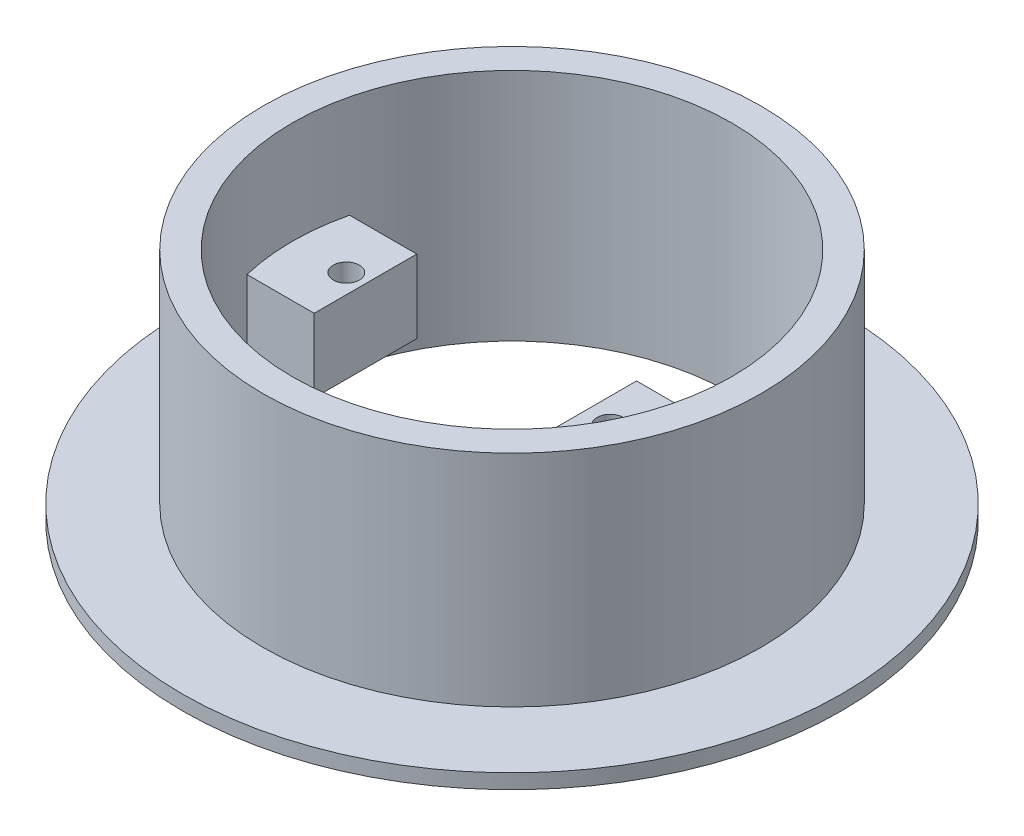
ISO-10303-21;
HEADER;
FILE_DESCRIPTION(('STEP AP214'),'2;1');
FILE_NAME('part.step','',(''),(''),'','','');
FILE_SCHEMA(('AUTOMOTIVE_DESIGN { 1 0 10303 214 1 1 1 1 }'));
ENDSEC;
DATA;
#1=APPLICATION_CONTEXT('core data for automotive mechanical design processes');
#2=APPLICATION_PROTOCOL_DEFINITION('international standard','automotive_design',2000,#1);
#3=PRODUCT_CONTEXT('',#1,'mechanical');
#4=PRODUCT('Part','Part','',(#3));
#5=PRODUCT_RELATED_PRODUCT_CATEGORY('part','',(#4));
#6=PRODUCT_DEFINITION_FORMATION('','',#4);
#7=PRODUCT_DEFINITION_CONTEXT('part definition',#1,'design');
#8=PRODUCT_DEFINITION('design','',#6,#7);
#9=PRODUCT_DEFINITION_SHAPE('','',#8);
#10=(LENGTH_UNIT() NAMED_UNIT(*) SI_UNIT(.MILLI.,.METRE.));
#11=(NAMED_UNIT(*) PLANE_ANGLE_UNIT() SI_UNIT($,.RADIAN.));
#12=(NAMED_UNIT(*) SI_UNIT($,.STERADIAN.) SOLID_ANGLE_UNIT());
#13=UNCERTAINTY_MEASURE_WITH_UNIT(LENGTH_MEASURE(1.E-05),#10,'distance_accuracy_value','');
#14=(GEOMETRIC_REPRESENTATION_CONTEXT(3) GLOBAL_UNCERTAINTY_ASSIGNED_CONTEXT((#13)) GLOBAL_UNIT_ASSIGNED_CONTEXT((#10,
#11,#12)) REPRESENTATION_CONTEXT('',''));
#15=CARTESIAN_POINT('',(0.,0.,0.));
#16=DIRECTION('',(0.,0.,1.));
#17=DIRECTION('',(1.,0.,0.));
#18=AXIS2_PLACEMENT_3D('',#15,#16,#17);
#19=CARTESIAN_POINT('',(10.,18.,7.));
#20=DIRECTION('',(1.,0.,0.));
#21=DIRECTION('',(0.,1.,0.));
#22=AXIS2_PLACEMENT_3D('',#19,#20,#21);
#23=PLANE('',#22);
#24=DIRECTION('',(0.,-1.,0.));
#25=VECTOR('',#24,1.);
#26=CARTESIAN_POINT('',(10.,18.,-7.));
#27=LINE('',#26,#25);
#28=CARTESIAN_POINT('',(10.,18.,-7.));
#29=VERTEX_POINT('',#28);
#30=CARTESIAN_POINT('',(10.,2.,-7.));
#31=VERTEX_POINT('',#30);
#32=EDGE_CURVE('E57',#29,#31,#27,.T.);
#33=ORIENTED_EDGE('',*,*,#32,.T.);
#34=DIRECTION('',(0.,0.,1.));
#35=VECTOR('',#34,1.);
#36=CARTESIAN_POINT('',(10.,2.,7.));
#37=LINE('',#36,#35);
#38=CARTESIAN_POINT('',(10.,2.,7.));
#39=VERTEX_POINT('',#38);
#40=EDGE_CURVE('E64',#31,#39,#37,.T.);
#41=ORIENTED_EDGE('',*,*,#40,.T.);
#42=DIRECTION('',(0.,-1.,0.));
#43=VECTOR('',#42,1.);
#44=CARTESIAN_POINT('',(10.,18.,7.));
#45=LINE('',#44,#43);
#46=CARTESIAN_POINT('',(10.,18.,7.));
#47=VERTEX_POINT('',#46);
#48=EDGE_CURVE('E100',#47,#39,#45,.T.);
#49=ORIENTED_EDGE('',*,*,#48,.F.);
#50=DIRECTION('',(0.,0.,-1.));
#51=VECTOR('',#50,1.);
#52=CARTESIAN_POINT('',(10.,18.,7.));
#53=LINE('',#52,#51);
#54=EDGE_CURVE('E92',#47,#29,#53,.T.);
#55=ORIENTED_EDGE('',*,*,#54,.T.);
#56=EDGE_LOOP('',(#33,#41,#49,#55));
#57=FACE_BOUND('',#56,.T.);
#58=ADVANCED_FACE('F49',(#57),#23,.F.);
#59=CARTESIAN_POINT('',(17.,18.,7.));
#60=DIRECTION('',(1.,0.,0.));
#61=DIRECTION('',(0.,1.,0.));
#62=AXIS2_PLACEMENT_3D('',#59,#60,#61);
#63=PLANE('',#62);
#64=DIRECTION('',(0.,0.,1.));
#65=VECTOR('',#64,1.);
#66=CARTESIAN_POINT('',(17.,2.,7.));
#67=LINE('',#66,#65);
#68=CARTESIAN_POINT('',(17.,2.,-7.));
#69=VERTEX_POINT('',#68);
#70=CARTESIAN_POINT('',(17.,2.,7.));
#71=VERTEX_POINT('',#70);
#72=EDGE_CURVE('E115',#69,#71,#67,.T.);
#73=ORIENTED_EDGE('',*,*,#72,.F.);
#74=DIRECTION('',(0.,-1.,0.));
#75=VECTOR('',#74,1.);
#76=CARTESIAN_POINT('',(17.,18.,-7.));
#77=LINE('',#76,#75);
#78=CARTESIAN_POINT('',(17.,18.,-7.));
#79=VERTEX_POINT('',#78);
#80=EDGE_CURVE('E90',#79,#69,#77,.T.);
#81=ORIENTED_EDGE('',*,*,#80,.F.);
#82=DIRECTION('',(0.,0.,-1.));
#83=VECTOR('',#82,1.);
#84=CARTESIAN_POINT('',(17.,18.,7.));
#85=LINE('',#84,#83);
#86=CARTESIAN_POINT('',(17.,18.,7.));
#87=VERTEX_POINT('',#86);
#88=EDGE_CURVE('E72',#87,#79,#85,.T.);
#89=ORIENTED_EDGE('',*,*,#88,.F.);
#90=DIRECTION('',(0.,-1.,0.));
#91=VECTOR('',#90,1.);
#92=CARTESIAN_POINT('',(17.,18.,7.));
#93=LINE('',#92,#91);
#94=EDGE_CURVE('E88',#87,#71,#93,.T.);
#95=ORIENTED_EDGE('',*,*,#94,.T.);
#96=EDGE_LOOP('',(#73,#81,#89,#95));
#97=FACE_BOUND('',#96,.T.);
#98=ADVANCED_FACE('F86',(#97),#63,.T.);
#99=CARTESIAN_POINT('',(10.,18.,7.));
#100=DIRECTION('',(0.,1.,0.));
#101=DIRECTION('',(0.,0.,1.));
#102=AXIS2_PLACEMENT_3D('',#99,#100,#101);
#103=PLANE('',#102);
#104=CARTESIAN_POINT('',(13.3884337890028,18.,0.));
#105=DIRECTION('',(0.,1.,0.));
#106=DIRECTION('',(0.,0.,1.));
#107=AXIS2_PLACEMENT_3D('',#104,#105,#106);
#108=CIRCLE('',#107,1.775);
#109=CARTESIAN_POINT('',(13.3884337890028,18.,1.775));
#110=VERTEX_POINT('',#109);
#111=EDGE_CURVE('E155',#110,#110,#108,.T.);
#112=ORIENTED_EDGE('',*,*,#111,.F.);
#113=EDGE_LOOP('',(#112));
#114=FACE_BOUND('',#113,.T.);
#115=DIRECTION('',(1.,0.,0.));
#116=VECTOR('',#115,1.);
#117=CARTESIAN_POINT('',(10.,18.,-7.));
#118=LINE('',#117,#116);
#119=EDGE_CURVE('E108',#29,#79,#118,.T.);
#120=ORIENTED_EDGE('',*,*,#119,.F.);
#121=ORIENTED_EDGE('',*,*,#54,.F.);
#122=DIRECTION('',(1.,0.,0.));
#123=VECTOR('',#122,1.);
#124=CARTESIAN_POINT('',(10.,18.,7.));
#125=LINE('',#124,#123);
#126=EDGE_CURVE('E99',#47,#87,#125,.T.);
#127=ORIENTED_EDGE('',*,*,#126,.T.);
#128=ORIENTED_EDGE('',*,*,#88,.T.);
#129=EDGE_LOOP('',(#120,#121,#127,#128));
#130=FACE_BOUND('',#129,.T.);
#131=ADVANCED_FACE('F102',(#114,#130),#103,.T.);
#132=CARTESIAN_POINT('',(0.,0.,7.));
#133=DIRECTION('',(0.,0.,1.));
#134=DIRECTION('',(1.,0.,0.));
#135=AXIS2_PLACEMENT_3D('',#132,#133,#134);
#136=PLANE('',#135);
#137=DIRECTION('',(-1.,0.,0.));
#138=VECTOR('',#137,1.);
#139=CARTESIAN_POINT('',(0.,2.,7.));
#140=LINE('',#139,#138);
#141=EDGE_CURVE('E93',#71,#39,#140,.T.);
#142=ORIENTED_EDGE('',*,*,#141,.F.);
#143=ORIENTED_EDGE('',*,*,#94,.F.);
#144=ORIENTED_EDGE('',*,*,#126,.F.);
#145=ORIENTED_EDGE('',*,*,#48,.T.);
#146=EDGE_LOOP('',(#142,#143,#144,#145));
#147=FACE_BOUND('',#146,.T.);
#148=ADVANCED_FACE('F51',(#147),#136,.T.);
#149=CARTESIAN_POINT('',(0.,0.,-7.));
#150=DIRECTION('',(0.,0.,1.));
#151=DIRECTION('',(1.,0.,0.));
#152=AXIS2_PLACEMENT_3D('',#149,#150,#151);
#153=PLANE('',#152);
#154=ORIENTED_EDGE('',*,*,#80,.T.);
#155=DIRECTION('',(-1.,0.,0.));
#156=VECTOR('',#155,1.);
#157=CARTESIAN_POINT('',(0.,2.,-7.));
#158=LINE('',#157,#156);
#159=EDGE_CURVE('E12',#69,#31,#158,.T.);
#160=ORIENTED_EDGE('',*,*,#159,.T.);
#161=ORIENTED_EDGE('',*,*,#32,.F.);
#162=ORIENTED_EDGE('',*,*,#119,.T.);
#163=EDGE_LOOP('',(#154,#160,#161,#162));
#164=FACE_BOUND('',#163,.T.);
#165=ADVANCED_FACE('F176',(#164),#153,.F.);
#166=CARTESIAN_POINT('',(0.,2.,0.));
#167=DIRECTION('',(0.,1.,0.));
#168=DIRECTION('',(0.,0.,1.));
#169=AXIS2_PLACEMENT_3D('',#166,#167,#168);
#170=PLANE('',#169);
#171=ORIENTED_EDGE('',*,*,#72,.T.);
#172=ORIENTED_EDGE('',*,*,#141,.T.);
#173=ORIENTED_EDGE('',*,*,#40,.F.);
#174=ORIENTED_EDGE('',*,*,#159,.F.);
#175=EDGE_LOOP('',(#171,#172,#173,#174));
#176=FACE_BOUND('',#175,.T.);
#177=DIRECTION('',(0.,0.,-1.));
#178=VECTOR('',#177,1.);
#179=CARTESIAN_POINT('',(9.01604117702178,2.,10.6853298303884));
#180=LINE('',#179,#178);
#181=CARTESIAN_POINT('',(9.01604117702178,2.,10.6853298303884));
#182=VERTEX_POINT('',#181);
#183=CARTESIAN_POINT('',(9.01604117702178,2.,-11.4713161582011));
#184=VERTEX_POINT('',#183);
#185=EDGE_CURVE('E121',#182,#184,#180,.T.);
#186=ORIENTED_EDGE('',*,*,#185,.F.);
#187=DIRECTION('',(0.985167795898411,0.,0.17159374675281));
#188=VECTOR('',#187,1.);
#189=CARTESIAN_POINT('',(9.01604117702178,2.,10.6853298303884));
#190=LINE('',#189,#188);
#191=CARTESIAN_POINT('',(26.6591042443495,2.,13.7583487704341));
#192=VERTEX_POINT('',#191);
#193=EDGE_CURVE('E136',#182,#192,#190,.T.);
#194=ORIENTED_EDGE('',*,*,#193,.T.);
#195=CARTESIAN_POINT('',(-0.546139414020683,2.,0.0104602003278405));
#196=DIRECTION('',(0.,1.,0.));
#197=DIRECTION('',(0.,0.,1.));
#198=AXIS2_PLACEMENT_3D('',#195,#196,#197);
#199=CIRCLE('',#198,30.4816292649745);
#200=CARTESIAN_POINT('',(26.1127186831509,2.,-14.7690867346164));
#201=VERTEX_POINT('',#200);
#202=EDGE_CURVE('E125',#201,#192,#199,.F.);
#203=ORIENTED_EDGE('',*,*,#202,.F.);
#204=DIRECTION('',(0.981900338780085,0.,-0.189398322863628));
#205=VECTOR('',#204,1.);
#206=CARTESIAN_POINT('',(9.01604117702178,2.,-11.4713161582011));
#207=LINE('',#206,#205);
#208=EDGE_CURVE('E126',#184,#201,#207,.T.);
#209=ORIENTED_EDGE('',*,*,#208,.F.);
#210=EDGE_LOOP('',(#186,#194,#203,#209));
#211=FACE_BOUND('',#210,.T.);
#212=ADVANCED_FACE('F186',(#176,#211),#170,.T.);
#213=CARTESIAN_POINT('',(9.01604117702178,37.375668323243,-11.4713161582011));
#214=DIRECTION('',(-0.189398322863628,0.,-0.981900338780085));
#215=DIRECTION('',(-0.981900338780085,0.,0.189398322863628));
#216=AXIS2_PLACEMENT_3D('',#213,#214,#215);
#217=PLANE('',#216);
#218=DIRECTION('',(0.,-1.,0.));
#219=VECTOR('',#218,1.);
#220=CARTESIAN_POINT('',(9.01604117702178,37.375668323243,-11.4713161582011));
#221=LINE('',#220,#219);
#222=CARTESIAN_POINT('',(9.01604117702178,0.,-11.4713161582011));
#223=VERTEX_POINT('',#222);
#224=EDGE_CURVE('E118',#184,#223,#221,.T.);
#225=ORIENTED_EDGE('',*,*,#224,.F.);
#226=ORIENTED_EDGE('',*,*,#208,.T.);
#227=DIRECTION('',(0.,-1.,0.));
#228=VECTOR('',#227,1.);
#229=CARTESIAN_POINT('',(26.1127186831509,37.375668323243,-14.7690867346164));
#230=LINE('',#229,#228);
#231=CARTESIAN_POINT('',(26.1127186831509,0.,-14.7690867346164));
#232=VERTEX_POINT('',#231);
#233=EDGE_CURVE('E122',#201,#232,#230,.T.);
#234=ORIENTED_EDGE('',*,*,#233,.T.);
#235=DIRECTION('',(0.981900338780085,0.,-0.189398322863628));
#236=VECTOR('',#235,1.);
#237=CARTESIAN_POINT('',(9.01604117702178,0.,-11.4713161582011));
#238=LINE('',#237,#236);
#239=EDGE_CURVE('E148',#223,#232,#238,.T.);
#240=ORIENTED_EDGE('',*,*,#239,.F.);
#241=EDGE_LOOP('',(#225,#226,#234,#240));
#242=FACE_BOUND('',#241,.T.);
#243=ADVANCED_FACE('F230',(#242),#217,.T.);
#244=CARTESIAN_POINT('',(-0.546139414020683,37.375668323243,0.0104602003278405));
#245=DIRECTION('',(0.,-1.,0.));
#246=DIRECTION('',(0.,0.,-1.));
#247=AXIS2_PLACEMENT_3D('',#244,#245,#246);
#248=CYLINDRICAL_SURFACE('',#247,30.4816292649745);
#249=ORIENTED_EDGE('',*,*,#233,.F.);
#250=ORIENTED_EDGE('',*,*,#202,.T.);
#251=DIRECTION('',(0.,-1.,0.));
#252=VECTOR('',#251,1.);
#253=CARTESIAN_POINT('',(26.6591042443495,37.375668323243,13.7583487704341));
#254=LINE('',#253,#252);
#255=CARTESIAN_POINT('',(26.6591042443495,0.,13.7583487704341));
#256=VERTEX_POINT('',#255);
#257=EDGE_CURVE('E127',#192,#256,#254,.T.);
#258=ORIENTED_EDGE('',*,*,#257,.T.);
#259=CARTESIAN_POINT('',(-0.546139414020683,0.,0.0104602003278405));
#260=DIRECTION('',(0.,-1.,0.));
#261=DIRECTION('',(0.,0.,-1.));
#262=AXIS2_PLACEMENT_3D('',#259,#260,#261);
#263=CIRCLE('',#262,30.4816292649745);
#264=EDGE_CURVE('E145',#232,#256,#263,.T.);
#265=ORIENTED_EDGE('',*,*,#264,.F.);
#266=EDGE_LOOP('',(#249,#250,#258,#265));
#267=FACE_BOUND('',#266,.T.);
#268=ADVANCED_FACE('F234',(#267),#248,.T.);
#269=CARTESIAN_POINT('',(9.01604117702178,37.375668323243,10.6853298303884));
#270=DIRECTION('',(0.17159374675281,0.,-0.985167795898411));
#271=DIRECTION('',(-0.985167795898411,0.,-0.17159374675281));
#272=AXIS2_PLACEMENT_3D('',#269,#270,#271);
#273=PLANE('',#272);
#274=ORIENTED_EDGE('',*,*,#193,.F.);
#275=DIRECTION('',(0.,-1.,0.));
#276=VECTOR('',#275,1.);
#277=CARTESIAN_POINT('',(9.01604117702178,37.375668323243,10.6853298303884));
#278=LINE('',#277,#276);
#279=CARTESIAN_POINT('',(9.01604117702178,0.,10.6853298303884));
#280=VERTEX_POINT('',#279);
#281=EDGE_CURVE('E130',#182,#280,#278,.T.);
#282=ORIENTED_EDGE('',*,*,#281,.T.);
#283=DIRECTION('',(0.98516779589841,0.,0.17159374675281));
#284=VECTOR('',#283,1.);
#285=CARTESIAN_POINT('',(9.01604117702178,0.,10.6853298303884));
#286=LINE('',#285,#284);
#287=EDGE_CURVE('E133',#280,#256,#286,.T.);
#288=ORIENTED_EDGE('',*,*,#287,.T.);
#289=ORIENTED_EDGE('',*,*,#257,.F.);
#290=EDGE_LOOP('',(#274,#282,#288,#289));
#291=FACE_BOUND('',#290,.T.);
#292=ADVANCED_FACE('F194',(#291),#273,.F.);
#293=CARTESIAN_POINT('',(9.01604117702178,37.375668323243,10.6853298303884));
#294=DIRECTION('',(-1.,0.,0.));
#295=DIRECTION('',(0.,0.,1.));
#296=AXIS2_PLACEMENT_3D('',#293,#294,#295);
#297=PLANE('',#296);
#298=ORIENTED_EDGE('',*,*,#281,.F.);
#299=ORIENTED_EDGE('',*,*,#185,.T.);
#300=ORIENTED_EDGE('',*,*,#224,.T.);
#301=DIRECTION('',(0.,0.,-1.));
#302=VECTOR('',#301,1.);
#303=CARTESIAN_POINT('',(9.01604117702178,0.,10.6853298303884));
#304=LINE('',#303,#302);
#305=EDGE_CURVE('E139',#280,#223,#304,.T.);
#306=ORIENTED_EDGE('',*,*,#305,.F.);
#307=EDGE_LOOP('',(#298,#299,#300,#306));
#308=FACE_BOUND('',#307,.T.);
#309=ADVANCED_FACE('F189',(#308),#297,.T.);
#310=CARTESIAN_POINT('',(10.,0.,7.));
#311=DIRECTION('',(0.,1.,0.));
#312=DIRECTION('',(0.,0.,1.));
#313=AXIS2_PLACEMENT_3D('',#310,#311,#312);
#314=PLANE('',#313);
#315=ORIENTED_EDGE('',*,*,#305,.T.);
#316=ORIENTED_EDGE('',*,*,#239,.T.);
#317=ORIENTED_EDGE('',*,*,#264,.T.);
#318=ORIENTED_EDGE('',*,*,#287,.F.);
#319=EDGE_LOOP('',(#315,#316,#317,#318));
#320=FACE_BOUND('',#319,.T.);
#321=ADVANCED_FACE('F166',(#320),#314,.F.);
#322=CARTESIAN_POINT('',(13.3884337890028,10.,0.));
#323=DIRECTION('',(0.,1.,0.));
#324=DIRECTION('',(0.,0.,1.));
#325=AXIS2_PLACEMENT_3D('',#322,#323,#324);
#326=CYLINDRICAL_SURFACE('',#325,1.775);
#327=CARTESIAN_POINT('',(13.3884337890028,10.,0.));
#328=DIRECTION('',(0.,1.,0.));
#329=DIRECTION('',(0.,0.,1.));
#330=AXIS2_PLACEMENT_3D('',#327,#328,#329);
#331=CIRCLE('',#330,1.775);
#332=CARTESIAN_POINT('',(13.3884337890028,10.,1.775));
#333=VERTEX_POINT('',#332);
#334=EDGE_CURVE('E140',#333,#333,#331,.T.);
#335=ORIENTED_EDGE('',*,*,#334,.F.);
#336=EDGE_LOOP('',(#335));
#337=FACE_BOUND('',#336,.T.);
#338=ORIENTED_EDGE('',*,*,#111,.T.);
#339=EDGE_LOOP('',(#338));
#340=FACE_BOUND('',#339,.T.);
#341=ADVANCED_FACE('F163',(#337,#340),#326,.F.);
#342=CARTESIAN_POINT('',(13.3884337890028,10.,0.));
#343=DIRECTION('',(0.,1.,0.));
#344=DIRECTION('',(0.,0.,1.));
#345=AXIS2_PLACEMENT_3D('',#342,#343,#344);
#346=PLANE('',#345);
#347=ORIENTED_EDGE('',*,*,#334,.T.);
#348=EDGE_LOOP('',(#347));
#349=FACE_BOUND('',#348,.T.);
#350=ADVANCED_FACE('F161',(#349),#346,.T.);
#351=CLOSED_SHELL('',(#58,#98,#131,#148,#165,#212,#243,#268,#292,#309,#321,#341,#350));
#352=MANIFOLD_SOLID_BREP('B2',#351);
#353=CARTESIAN_POINT('',(0.,2.,0.));
#354=DIRECTION('',(0.,1.,0.));
#355=DIRECTION('',(0.,0.,1.));
#356=AXIS2_PLACEMENT_3D('',#353,#354,#355);
#357=PLANE('',#356);
#358=CARTESIAN_POINT('',(0.,2.,0.));
#359=DIRECTION('',(0.,1.,0.));
#360=DIRECTION('',(0.,0.,1.));
#361=AXIS2_PLACEMENT_3D('',#358,#359,#360);
#362=CIRCLE('',#361,45.);
#363=CARTESIAN_POINT('',(0.,2.,45.));
#364=VERTEX_POINT('',#363);
#365=EDGE_CURVE('E405',#364,#364,#362,.T.);
#366=ORIENTED_EDGE('',*,*,#365,.T.);
#367=EDGE_LOOP('',(#366));
#368=FACE_BOUND('',#367,.T.);
#369=CARTESIAN_POINT('',(0.,2.,0.));
#370=DIRECTION('',(0.,1.,0.));
#371=DIRECTION('',(0.,0.,1.));
#372=AXIS2_PLACEMENT_3D('',#369,#370,#371);
#373=CIRCLE('',#372,34.);
#374=CARTESIAN_POINT('',(0.,2.,34.));
#375=VERTEX_POINT('',#374);
#376=EDGE_CURVE('E395',#375,#375,#373,.T.);
#377=ORIENTED_EDGE('',*,*,#376,.F.);
#378=EDGE_LOOP('',(#377));
#379=FACE_BOUND('',#378,.T.);
#380=ADVANCED_FACE('F321',(#368,#379),#357,.T.);
#381=CARTESIAN_POINT('',(0.,0.,0.));
#382=DIRECTION('',(0.,1.,0.));
#383=DIRECTION('',(0.,0.,1.));
#384=AXIS2_PLACEMENT_3D('',#381,#382,#383);
#385=PLANE('',#384);
#386=CARTESIAN_POINT('',(0.,0.,0.));
#387=DIRECTION('',(0.,1.,0.));
#388=DIRECTION('',(0.,0.,1.));
#389=AXIS2_PLACEMENT_3D('',#386,#387,#388);
#390=CIRCLE('',#389,45.);
#391=CARTESIAN_POINT('',(0.,0.,45.));
#392=VERTEX_POINT('',#391);
#393=EDGE_CURVE('E404',#392,#392,#390,.T.);
#394=ORIENTED_EDGE('',*,*,#393,.F.);
#395=EDGE_LOOP('',(#394));
#396=FACE_BOUND('',#395,.T.);
#397=CARTESIAN_POINT('',(0.,0.,0.));
#398=DIRECTION('',(0.,1.,0.));
#399=DIRECTION('',(0.,0.,1.));
#400=AXIS2_PLACEMENT_3D('',#397,#398,#399);
#401=CIRCLE('',#400,30.);
#402=CARTESIAN_POINT('',(0.,0.,30.));
#403=VERTEX_POINT('',#402);
#404=EDGE_CURVE('E399',#403,#403,#401,.T.);
#405=ORIENTED_EDGE('',*,*,#404,.T.);
#406=EDGE_LOOP('',(#405));
#407=FACE_BOUND('',#406,.T.);
#408=ADVANCED_FACE('F432',(#396,#407),#385,.F.);
#409=CARTESIAN_POINT('',(0.,2.,0.));
#410=DIRECTION('',(0.,-1.,0.));
#411=DIRECTION('',(0.,0.,-1.));
#412=AXIS2_PLACEMENT_3D('',#409,#410,#411);
#413=CYLINDRICAL_SURFACE('',#412,45.);
#414=ORIENTED_EDGE('',*,*,#365,.F.);
#415=EDGE_LOOP('',(#414));
#416=FACE_BOUND('',#415,.T.);
#417=ORIENTED_EDGE('',*,*,#393,.T.);
#418=EDGE_LOOP('',(#417));
#419=FACE_BOUND('',#418,.T.);
#420=ADVANCED_FACE('F323',(#416,#419),#413,.T.);
#421=CARTESIAN_POINT('',(0.,2.,0.));
#422=DIRECTION('',(0.,-1.,0.));
#423=DIRECTION('',(0.,0.,-1.));
#424=AXIS2_PLACEMENT_3D('',#421,#422,#423);
#425=CYLINDRICAL_SURFACE('',#424,30.);
#426=ORIENTED_EDGE('',*,*,#404,.F.);
#427=EDGE_LOOP('',(#426));
#428=FACE_BOUND('',#427,.T.);
#429=DIRECTION('',(0.,-1.,0.));
#430=VECTOR('',#429,1.);
#431=CARTESIAN_POINT('',(-29.1719042916296,2.,7.));
#432=LINE('',#431,#430);
#433=CARTESIAN_POINT('',(-29.1719042916296,18.,7.));
#434=VERTEX_POINT('',#433);
#435=CARTESIAN_POINT('',(-29.1719042916296,8.,7.));
#436=VERTEX_POINT('',#435);
#437=EDGE_CURVE('E47',#434,#436,#432,.T.);
#438=ORIENTED_EDGE('',*,*,#437,.F.);
#439=CARTESIAN_POINT('',(0.,18.,0.));
#440=DIRECTION('',(0.,-1.,0.));
#441=DIRECTION('',(0.,0.,-1.));
#442=AXIS2_PLACEMENT_3D('',#439,#440,#441);
#443=CIRCLE('',#442,30.);
#444=CARTESIAN_POINT('',(-29.1719042916296,18.,-7.));
#445=VERTEX_POINT('',#444);
#446=EDGE_CURVE('E344',#434,#445,#443,.T.);
#447=ORIENTED_EDGE('',*,*,#446,.T.);
#448=DIRECTION('',(0.,-1.,0.));
#449=VECTOR('',#448,1.);
#450=CARTESIAN_POINT('',(-29.1719042916296,2.,-7.));
#451=LINE('',#450,#449);
#452=CARTESIAN_POINT('',(-29.1719042916296,8.,-7.));
#453=VERTEX_POINT('',#452);
#454=EDGE_CURVE('E408',#445,#453,#451,.T.);
#455=ORIENTED_EDGE('',*,*,#454,.T.);
#456=CARTESIAN_POINT('',(0.,8.,0.));
#457=DIRECTION('',(0.,-1.,0.));
#458=DIRECTION('',(1.,0.,0.));
#459=AXIS2_PLACEMENT_3D('',#456,#457,#458);
#460=CIRCLE('',#459,30.);
#461=EDGE_CURVE('E329',#436,#453,#460,.T.);
#462=ORIENTED_EDGE('',*,*,#461,.F.);
#463=EDGE_LOOP('',(#438,#447,#455,#462));
#464=FACE_BOUND('',#463,.T.);
#465=CARTESIAN_POINT('',(0.,32.,0.));
#466=DIRECTION('',(0.,1.,0.));
#467=DIRECTION('',(0.,0.,1.));
#468=AXIS2_PLACEMENT_3D('',#465,#466,#467);
#469=CIRCLE('',#468,30.);
#470=CARTESIAN_POINT('',(0.,32.,30.));
#471=VERTEX_POINT('',#470);
#472=EDGE_CURVE('E371',#471,#471,#469,.T.);
#473=ORIENTED_EDGE('',*,*,#472,.T.);
#474=EDGE_LOOP('',(#473));
#475=FACE_BOUND('',#474,.T.);
#476=ADVANCED_FACE('F414',(#428,#464,#475),#425,.F.);
#477=CARTESIAN_POINT('',(0.,32.,0.));
#478=DIRECTION('',(0.,1.,0.));
#479=DIRECTION('',(0.,0.,1.));
#480=AXIS2_PLACEMENT_3D('',#477,#478,#479);
#481=PLANE('',#480);
#482=CARTESIAN_POINT('',(0.,32.,0.));
#483=DIRECTION('',(0.,1.,0.));
#484=DIRECTION('',(0.,0.,1.));
#485=AXIS2_PLACEMENT_3D('',#482,#483,#484);
#486=CIRCLE('',#485,34.);
#487=CARTESIAN_POINT('',(0.,32.,34.));
#488=VERTEX_POINT('',#487);
#489=EDGE_CURVE('E396',#488,#488,#486,.T.);
#490=ORIENTED_EDGE('',*,*,#489,.T.);
#491=EDGE_LOOP('',(#490));
#492=FACE_BOUND('',#491,.T.);
#493=ORIENTED_EDGE('',*,*,#472,.F.);
#494=EDGE_LOOP('',(#493));
#495=FACE_BOUND('',#494,.T.);
#496=ADVANCED_FACE('F443',(#492,#495),#481,.T.);
#497=CARTESIAN_POINT('',(0.,32.,0.));
#498=DIRECTION('',(0.,-1.,0.));
#499=DIRECTION('',(0.,0.,-1.));
#500=AXIS2_PLACEMENT_3D('',#497,#498,#499);
#501=CYLINDRICAL_SURFACE('',#500,34.);
#502=ORIENTED_EDGE('',*,*,#489,.F.);
#503=EDGE_LOOP('',(#502));
#504=FACE_BOUND('',#503,.T.);
#505=ORIENTED_EDGE('',*,*,#376,.T.);
#506=EDGE_LOOP('',(#505));
#507=FACE_BOUND('',#506,.T.);
#508=ADVANCED_FACE('F427',(#504,#507),#501,.T.);
#509=CARTESIAN_POINT('',(0.,8.,7.));
#510=DIRECTION('',(0.,-1.,0.));
#511=DIRECTION('',(1.,0.,0.));
#512=AXIS2_PLACEMENT_3D('',#509,#510,#511);
#513=PLANE('',#512);
#514=DIRECTION('',(-1.,0.,0.));
#515=VECTOR('',#514,1.);
#516=CARTESIAN_POINT('',(0.,8.,7.));
#517=LINE('',#516,#515);
#518=CARTESIAN_POINT('',(-20.,8.,7.));
#519=VERTEX_POINT('',#518);
#520=EDGE_CURVE('E367',#519,#436,#517,.T.);
#521=ORIENTED_EDGE('',*,*,#520,.T.);
#522=ORIENTED_EDGE('',*,*,#461,.T.);
#523=DIRECTION('',(-1.,0.,0.));
#524=VECTOR('',#523,1.);
#525=CARTESIAN_POINT('',(0.,8.,-7.));
#526=LINE('',#525,#524);
#527=CARTESIAN_POINT('',(-20.,8.,-7.));
#528=VERTEX_POINT('',#527);
#529=EDGE_CURVE('E336',#528,#453,#526,.T.);
#530=ORIENTED_EDGE('',*,*,#529,.F.);
#531=DIRECTION('',(0.,0.,-1.));
#532=VECTOR('',#531,1.);
#533=CARTESIAN_POINT('',(-20.,8.,7.));
#534=LINE('',#533,#532);
#535=EDGE_CURVE('E364',#519,#528,#534,.T.);
#536=ORIENTED_EDGE('',*,*,#535,.F.);
#537=EDGE_LOOP('',(#521,#522,#530,#536));
#538=FACE_BOUND('',#537,.T.);
#539=ADVANCED_FACE('F366',(#538),#513,.T.);
#540=CARTESIAN_POINT('',(0.,18.,7.));
#541=DIRECTION('',(0.,-1.,0.));
#542=DIRECTION('',(0.,0.,-1.));
#543=AXIS2_PLACEMENT_3D('',#540,#541,#542);
#544=PLANE('',#543);
#545=CARTESIAN_POINT('',(-22.6115662109972,18.,0.));
#546=DIRECTION('',(0.,1.,0.));
#547=DIRECTION('',(0.,0.,1.));
#548=AXIS2_PLACEMENT_3D('',#545,#546,#547);
#549=CIRCLE('',#548,1.775);
#550=CARTESIAN_POINT('',(-22.6115662109972,18.,1.775));
#551=VERTEX_POINT('',#550);
#552=EDGE_CURVE('E534',#551,#551,#549,.T.);
#553=ORIENTED_EDGE('',*,*,#552,.F.);
#554=EDGE_LOOP('',(#553));
#555=FACE_BOUND('',#554,.T.);
#556=ORIENTED_EDGE('',*,*,#446,.F.);
#557=DIRECTION('',(-1.,0.,0.));
#558=VECTOR('',#557,1.);
#559=CARTESIAN_POINT('',(0.,18.,7.));
#560=LINE('',#559,#558);
#561=CARTESIAN_POINT('',(-20.,18.,7.));
#562=VERTEX_POINT('',#561);
#563=EDGE_CURVE('E382',#562,#434,#560,.T.);
#564=ORIENTED_EDGE('',*,*,#563,.F.);
#565=DIRECTION('',(0.,0.,-1.));
#566=VECTOR('',#565,1.);
#567=CARTESIAN_POINT('',(-20.,18.,7.));
#568=LINE('',#567,#566);
#569=CARTESIAN_POINT('',(-20.,18.,-7.));
#570=VERTEX_POINT('',#569);
#571=EDGE_CURVE('E372',#562,#570,#568,.T.);
#572=ORIENTED_EDGE('',*,*,#571,.T.);
#573=DIRECTION('',(-1.,0.,0.));
#574=VECTOR('',#573,1.);
#575=CARTESIAN_POINT('',(0.,18.,-7.));
#576=LINE('',#575,#574);
#577=EDGE_CURVE('E379',#570,#445,#576,.T.);
#578=ORIENTED_EDGE('',*,*,#577,.T.);
#579=EDGE_LOOP('',(#556,#564,#572,#578));
#580=FACE_BOUND('',#579,.T.);
#581=ADVANCED_FACE('F418',(#555,#580),#544,.F.);
#582=CARTESIAN_POINT('',(-20.,0.,7.));
#583=DIRECTION('',(1.,0.,0.));
#584=DIRECTION('',(0.,1.,0.));
#585=AXIS2_PLACEMENT_3D('',#582,#583,#584);
#586=PLANE('',#585);
#587=DIRECTION('',(0.,-1.,0.));
#588=VECTOR('',#587,1.);
#589=CARTESIAN_POINT('',(-20.,0.,-7.));
#590=LINE('',#589,#588);
#591=EDGE_CURVE('E388',#570,#528,#590,.T.);
#592=ORIENTED_EDGE('',*,*,#591,.F.);
#593=ORIENTED_EDGE('',*,*,#571,.F.);
#594=DIRECTION('',(0.,-1.,0.));
#595=VECTOR('',#594,1.);
#596=CARTESIAN_POINT('',(-20.,0.,7.));
#597=LINE('',#596,#595);
#598=EDGE_CURVE('E377',#562,#519,#597,.T.);
#599=ORIENTED_EDGE('',*,*,#598,.T.);
#600=ORIENTED_EDGE('',*,*,#535,.T.);
#601=EDGE_LOOP('',(#592,#593,#599,#600));
#602=FACE_BOUND('',#601,.T.);
#603=ADVANCED_FACE('F381',(#602),#586,.T.);
#604=CARTESIAN_POINT('',(0.,0.,7.));
#605=DIRECTION('',(0.,0.,1.));
#606=DIRECTION('',(1.,0.,0.));
#607=AXIS2_PLACEMENT_3D('',#604,#605,#606);
#608=PLANE('',#607);
#609=ORIENTED_EDGE('',*,*,#563,.T.);
#610=ORIENTED_EDGE('',*,*,#437,.T.);
#611=ORIENTED_EDGE('',*,*,#520,.F.);
#612=ORIENTED_EDGE('',*,*,#598,.F.);
#613=EDGE_LOOP('',(#609,#610,#611,#612));
#614=FACE_BOUND('',#613,.T.);
#615=ADVANCED_FACE('F376',(#614),#608,.T.);
#616=CARTESIAN_POINT('',(0.,0.,-7.));
#617=DIRECTION('',(0.,0.,1.));
#618=DIRECTION('',(1.,0.,0.));
#619=AXIS2_PLACEMENT_3D('',#616,#617,#618);
#620=PLANE('',#619);
#621=ORIENTED_EDGE('',*,*,#454,.F.);
#622=ORIENTED_EDGE('',*,*,#577,.F.);
#623=ORIENTED_EDGE('',*,*,#591,.T.);
#624=ORIENTED_EDGE('',*,*,#529,.T.);
#625=EDGE_LOOP('',(#621,#622,#623,#624));
#626=FACE_BOUND('',#625,.T.);
#627=ADVANCED_FACE('F417',(#626),#620,.F.);
#628=CARTESIAN_POINT('',(-22.6115662109972,10.,0.));
#629=DIRECTION('',(0.,1.,0.));
#630=DIRECTION('',(0.,0.,1.));
#631=AXIS2_PLACEMENT_3D('',#628,#629,#630);
#632=CYLINDRICAL_SURFACE('',#631,1.775);
#633=CARTESIAN_POINT('',(-22.6115662109972,10.,0.));
#634=DIRECTION('',(0.,1.,0.));
#635=DIRECTION('',(0.,0.,1.));
#636=AXIS2_PLACEMENT_3D('',#633,#634,#635);
#637=CIRCLE('',#636,1.775);
#638=CARTESIAN_POINT('',(-22.6115662109972,10.,1.775));
#639=VERTEX_POINT('',#638);
#640=EDGE_CURVE('E389',#639,#639,#637,.T.);
#641=ORIENTED_EDGE('',*,*,#640,.F.);
#642=EDGE_LOOP('',(#641));
#643=FACE_BOUND('',#642,.T.);
#644=ORIENTED_EDGE('',*,*,#552,.T.);
#645=EDGE_LOOP('',(#644));
#646=FACE_BOUND('',#645,.T.);
#647=ADVANCED_FACE('F494',(#643,#646),#632,.F.);
#648=CARTESIAN_POINT('',(-22.6115662109972,10.,0.));
#649=DIRECTION('',(0.,1.,0.));
#650=DIRECTION('',(0.,0.,1.));
#651=AXIS2_PLACEMENT_3D('',#648,#649,#650);
#652=PLANE('',#651);
#653=ORIENTED_EDGE('',*,*,#640,.T.);
#654=EDGE_LOOP('',(#653));
#655=FACE_BOUND('',#654,.T.);
#656=ADVANCED_FACE('F518',(#655),#652,.T.);
#657=CLOSED_SHELL('',(#380,#408,#420,#476,#496,#508,#539,#581,#603,#615,#627,#647,#656));
#658=MANIFOLD_SOLID_BREP('B6',#657);
#659=ADVANCED_BREP_SHAPE_REPRESENTATION('',(#18,#352,#658),#14);
#660=SHAPE_DEFINITION_REPRESENTATION(#9,#659);
ENDSEC;
END-ISO-10303-21;
